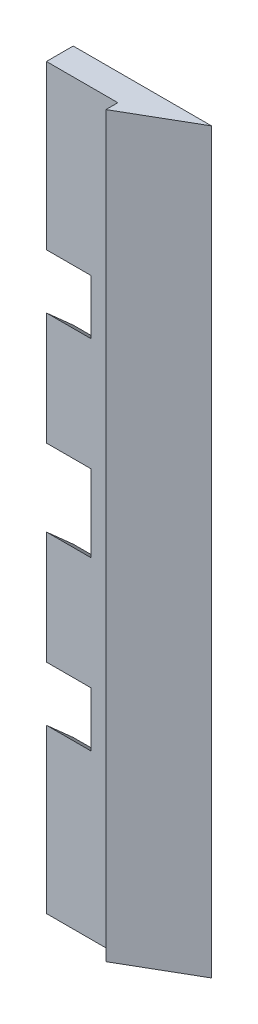
ISO-10303-21;
HEADER;
FILE_DESCRIPTION(('STEP AP214'),'2;1');
FILE_NAME('part.step','',(''),(''),'','','');
FILE_SCHEMA(('AUTOMOTIVE_DESIGN { 1 0 10303 214 1 1 1 1 }'));
ENDSEC;
DATA;
#1=APPLICATION_CONTEXT('core data for automotive mechanical design processes');
#2=APPLICATION_PROTOCOL_DEFINITION('international standard','automotive_design',2000,#1);
#3=PRODUCT_CONTEXT('',#1,'mechanical');
#4=PRODUCT('Part','Part','',(#3));
#5=PRODUCT_RELATED_PRODUCT_CATEGORY('part','',(#4));
#6=PRODUCT_DEFINITION_FORMATION('','',#4);
#7=PRODUCT_DEFINITION_CONTEXT('part definition',#1,'design');
#8=PRODUCT_DEFINITION('design','',#6,#7);
#9=PRODUCT_DEFINITION_SHAPE('','',#8);
#10=(LENGTH_UNIT() NAMED_UNIT(*) SI_UNIT(.MILLI.,.METRE.));
#11=(NAMED_UNIT(*) PLANE_ANGLE_UNIT() SI_UNIT($,.RADIAN.));
#12=(NAMED_UNIT(*) SI_UNIT($,.STERADIAN.) SOLID_ANGLE_UNIT());
#13=UNCERTAINTY_MEASURE_WITH_UNIT(LENGTH_MEASURE(1.E-05),#10,'distance_accuracy_value','');
#14=(GEOMETRIC_REPRESENTATION_CONTEXT(3) GLOBAL_UNCERTAINTY_ASSIGNED_CONTEXT((#13)) GLOBAL_UNIT_ASSIGNED_CONTEXT((#10,
#11,#12)) REPRESENTATION_CONTEXT('',''));
#15=CARTESIAN_POINT('',(0.,0.,0.));
#16=DIRECTION('',(0.,0.,1.));
#17=DIRECTION('',(1.,0.,0.));
#18=AXIS2_PLACEMENT_3D('',#15,#16,#17);
#19=CARTESIAN_POINT('',(0.,-99.2,4.));
#20=DIRECTION('',(-1.,0.,0.));
#21=DIRECTION('',(0.,0.,1.));
#22=AXIS2_PLACEMENT_3D('',#19,#20,#21);
#23=PLANE('',#22);
#24=DIRECTION('',(0.,-1.,0.));
#25=VECTOR('',#24,1.);
#26=CARTESIAN_POINT('',(0.,0.,3.6));
#27=LINE('',#26,#25);
#28=CARTESIAN_POINT('',(0.,0.,3.6));
#29=VERTEX_POINT('',#28);
#30=CARTESIAN_POINT('',(0.,-21.925,3.6));
#31=VERTEX_POINT('',#30);
#32=EDGE_CURVE('E199',#29,#31,#27,.T.);
#33=ORIENTED_EDGE('',*,*,#32,.F.);
#34=DIRECTION('',(0.,0.,1.));
#35=VECTOR('',#34,1.);
#36=CARTESIAN_POINT('',(0.,0.,4.));
#37=LINE('',#36,#35);
#38=CARTESIAN_POINT('',(0.,0.,0.));
#39=VERTEX_POINT('',#38);
#40=EDGE_CURVE('E179',#39,#29,#37,.T.);
#41=ORIENTED_EDGE('',*,*,#40,.F.);
#42=DIRECTION('',(0.,1.,0.));
#43=VECTOR('',#42,1.);
#44=CARTESIAN_POINT('',(0.,-99.2,0.));
#45=LINE('',#44,#43);
#46=CARTESIAN_POINT('',(0.,-18.7075,0.));
#47=VERTEX_POINT('',#46);
#48=EDGE_CURVE('E304',#47,#39,#45,.T.);
#49=ORIENTED_EDGE('',*,*,#48,.F.);
#50=DIRECTION('',(0.,0.666386109322577,-0.745606835605682));
#51=VECTOR('',#50,1.);
#52=CARTESIAN_POINT('',(0.,-18.35,-0.400000000000002));
#53=LINE('',#52,#51);
#54=EDGE_CURVE('E211',#31,#47,#53,.T.);
#55=ORIENTED_EDGE('',*,*,#54,.F.);
#56=EDGE_LOOP('',(#33,#41,#49,#55));
#57=FACE_BOUND('',#56,.T.);
#58=ADVANCED_FACE('F45',(#57),#23,.T.);
#59=CARTESIAN_POINT('',(0.,-29.275,3.6));
#60=VERTEX_POINT('',#59);
#61=CARTESIAN_POINT('',(0.,-44.425,3.6));
#62=VERTEX_POINT('',#61);
#63=EDGE_CURVE('E202',#60,#62,#27,.T.);
#64=ORIENTED_EDGE('',*,*,#63,.F.);
#65=DIRECTION('',(0.,0.666386109322577,0.745606835605682));
#66=VECTOR('',#65,1.);
#67=CARTESIAN_POINT('',(0.,-29.275,3.6));
#68=LINE('',#67,#66);
#69=CARTESIAN_POINT('',(0.,-32.4925,0.));
#70=VERTEX_POINT('',#69);
#71=EDGE_CURVE('E217',#70,#60,#68,.T.);
#72=ORIENTED_EDGE('',*,*,#71,.F.);
#73=CARTESIAN_POINT('',(0.,-41.2075,0.));
#74=VERTEX_POINT('',#73);
#75=EDGE_CURVE('E346',#74,#70,#45,.T.);
#76=ORIENTED_EDGE('',*,*,#75,.F.);
#77=DIRECTION('',(0.,0.666386109322578,-0.745606835605681));
#78=VECTOR('',#77,1.);
#79=CARTESIAN_POINT('',(0.,-40.85,-0.400000000000002));
#80=LINE('',#79,#78);
#81=EDGE_CURVE('E238',#62,#74,#80,.T.);
#82=ORIENTED_EDGE('',*,*,#81,.F.);
#83=EDGE_LOOP('',(#64,#72,#76,#82));
#84=FACE_BOUND('',#83,.T.);
#85=ADVANCED_FACE('F344',(#84),#23,.T.);
#86=CARTESIAN_POINT('',(0.,-54.775,3.6));
#87=VERTEX_POINT('',#86);
#88=CARTESIAN_POINT('',(0.,-69.925,3.6));
#89=VERTEX_POINT('',#88);
#90=EDGE_CURVE('E197',#87,#89,#27,.T.);
#91=ORIENTED_EDGE('',*,*,#90,.F.);
#92=DIRECTION('',(0.,0.666386109322578,0.745606835605681));
#93=VECTOR('',#92,1.);
#94=CARTESIAN_POINT('',(0.,-54.775,3.6));
#95=LINE('',#94,#93);
#96=CARTESIAN_POINT('',(0.,-57.9925,0.));
#97=VERTEX_POINT('',#96);
#98=EDGE_CURVE('E221',#97,#87,#95,.T.);
#99=ORIENTED_EDGE('',*,*,#98,.F.);
#100=CARTESIAN_POINT('',(0.,-66.7075,0.));
#101=VERTEX_POINT('',#100);
#102=EDGE_CURVE('E303',#101,#97,#45,.T.);
#103=ORIENTED_EDGE('',*,*,#102,.F.);
#104=DIRECTION('',(0.,0.666386109322578,-0.745606835605681));
#105=VECTOR('',#104,1.);
#106=CARTESIAN_POINT('',(0.,-69.925,3.6));
#107=LINE('',#106,#105);
#108=EDGE_CURVE('E237',#89,#101,#107,.T.);
#109=ORIENTED_EDGE('',*,*,#108,.F.);
#110=EDGE_LOOP('',(#91,#99,#103,#109));
#111=FACE_BOUND('',#110,.T.);
#112=ADVANCED_FACE('F384',(#111),#23,.T.);
#113=CARTESIAN_POINT('',(0.,-77.275,3.6));
#114=VERTEX_POINT('',#113);
#115=CARTESIAN_POINT('',(0.,-99.2,3.6));
#116=VERTEX_POINT('',#115);
#117=EDGE_CURVE('E194',#114,#116,#27,.T.);
#118=ORIENTED_EDGE('',*,*,#117,.F.);
#119=DIRECTION('',(0.,0.666386109322578,0.745606835605681));
#120=VECTOR('',#119,1.);
#121=CARTESIAN_POINT('',(0.,-80.85,-0.400000000000002));
#122=LINE('',#121,#120);
#123=CARTESIAN_POINT('',(0.,-80.4925,0.));
#124=VERTEX_POINT('',#123);
#125=EDGE_CURVE('E260',#124,#114,#122,.T.);
#126=ORIENTED_EDGE('',*,*,#125,.F.);
#127=CARTESIAN_POINT('',(0.,-99.2,0.));
#128=VERTEX_POINT('',#127);
#129=EDGE_CURVE('E298',#128,#124,#45,.T.);
#130=ORIENTED_EDGE('',*,*,#129,.F.);
#131=DIRECTION('',(0.,0.,1.));
#132=VECTOR('',#131,1.);
#133=CARTESIAN_POINT('',(0.,-99.2,4.));
#134=LINE('',#133,#132);
#135=EDGE_CURVE('E276',#128,#116,#134,.T.);
#136=ORIENTED_EDGE('',*,*,#135,.T.);
#137=EDGE_LOOP('',(#118,#126,#130,#136));
#138=FACE_BOUND('',#137,.T.);
#139=ADVANCED_FACE('F47',(#138),#23,.T.);
#140=CARTESIAN_POINT('',(0.,-99.2,0.));
#141=DIRECTION('',(0.,0.,-1.));
#142=DIRECTION('',(-1.,0.,0.));
#143=AXIS2_PLACEMENT_3D('',#140,#141,#142);
#144=PLANE('',#143);
#145=DIRECTION('',(1.,0.,0.));
#146=VECTOR('',#145,1.);
#147=CARTESIAN_POINT('',(0.,-18.7075,0.));
#148=LINE('',#147,#146);
#149=CARTESIAN_POINT('',(6.,-18.7075,0.));
#150=VERTEX_POINT('',#149);
#151=EDGE_CURVE('E11',#47,#150,#148,.T.);
#152=ORIENTED_EDGE('',*,*,#151,.F.);
#153=ORIENTED_EDGE('',*,*,#48,.T.);
#154=DIRECTION('',(-1.,0.,0.));
#155=VECTOR('',#154,1.);
#156=CARTESIAN_POINT('',(0.,0.,0.));
#157=LINE('',#156,#155);
#158=CARTESIAN_POINT('',(18.6,0.,0.));
#159=VERTEX_POINT('',#158);
#160=EDGE_CURVE('E281',#159,#39,#157,.T.);
#161=ORIENTED_EDGE('',*,*,#160,.F.);
#162=DIRECTION('',(0.,1.,0.));
#163=VECTOR('',#162,1.);
#164=CARTESIAN_POINT('',(18.6,-99.2,0.));
#165=LINE('',#164,#163);
#166=CARTESIAN_POINT('',(18.6,-99.2,0.));
#167=VERTEX_POINT('',#166);
#168=EDGE_CURVE('E305',#167,#159,#165,.T.);
#169=ORIENTED_EDGE('',*,*,#168,.F.);
#170=DIRECTION('',(-1.,0.,0.));
#171=VECTOR('',#170,1.);
#172=CARTESIAN_POINT('',(0.,-99.2,0.));
#173=LINE('',#172,#171);
#174=EDGE_CURVE('E288',#167,#128,#173,.T.);
#175=ORIENTED_EDGE('',*,*,#174,.T.);
#176=ORIENTED_EDGE('',*,*,#129,.T.);
#177=DIRECTION('',(-1.,0.,0.));
#178=VECTOR('',#177,1.);
#179=CARTESIAN_POINT('',(0.,-80.4925,0.));
#180=LINE('',#179,#178);
#181=CARTESIAN_POINT('',(6.,-80.4925,0.));
#182=VERTEX_POINT('',#181);
#183=EDGE_CURVE('E317',#182,#124,#180,.T.);
#184=ORIENTED_EDGE('',*,*,#183,.F.);
#185=DIRECTION('',(0.,1.,0.));
#186=VECTOR('',#185,1.);
#187=CARTESIAN_POINT('',(6.,-99.2,0.));
#188=LINE('',#187,#186);
#189=CARTESIAN_POINT('',(6.,-66.7075,0.));
#190=VERTEX_POINT('',#189);
#191=EDGE_CURVE('E302',#182,#190,#188,.T.);
#192=ORIENTED_EDGE('',*,*,#191,.T.);
#193=DIRECTION('',(1.,0.,0.));
#194=VECTOR('',#193,1.);
#195=CARTESIAN_POINT('',(0.,-66.7075,0.));
#196=LINE('',#195,#194);
#197=EDGE_CURVE('E313',#101,#190,#196,.T.);
#198=ORIENTED_EDGE('',*,*,#197,.F.);
#199=ORIENTED_EDGE('',*,*,#102,.T.);
#200=DIRECTION('',(-1.,0.,0.));
#201=VECTOR('',#200,1.);
#202=CARTESIAN_POINT('',(0.,-57.9925,0.));
#203=LINE('',#202,#201);
#204=CARTESIAN_POINT('',(6.,-57.9925,0.));
#205=VERTEX_POINT('',#204);
#206=EDGE_CURVE('E323',#205,#97,#203,.T.);
#207=ORIENTED_EDGE('',*,*,#206,.F.);
#208=DIRECTION('',(0.,-1.,0.));
#209=VECTOR('',#208,1.);
#210=CARTESIAN_POINT('',(6.,-99.2,0.));
#211=LINE('',#210,#209);
#212=CARTESIAN_POINT('',(6.,-41.2075,0.));
#213=VERTEX_POINT('',#212);
#214=EDGE_CURVE('E320',#213,#205,#211,.T.);
#215=ORIENTED_EDGE('',*,*,#214,.F.);
#216=DIRECTION('',(1.,0.,0.));
#217=VECTOR('',#216,1.);
#218=CARTESIAN_POINT('',(0.,-41.2075,0.));
#219=LINE('',#218,#217);
#220=EDGE_CURVE('E326',#74,#213,#219,.T.);
#221=ORIENTED_EDGE('',*,*,#220,.F.);
#222=ORIENTED_EDGE('',*,*,#75,.T.);
#223=DIRECTION('',(-1.,0.,0.));
#224=VECTOR('',#223,1.);
#225=CARTESIAN_POINT('',(0.,-32.4925,0.));
#226=LINE('',#225,#224);
#227=CARTESIAN_POINT('',(6.,-32.4925,0.));
#228=VERTEX_POINT('',#227);
#229=EDGE_CURVE('E54',#228,#70,#226,.T.);
#230=ORIENTED_EDGE('',*,*,#229,.F.);
#231=DIRECTION('',(0.,-1.,0.));
#232=VECTOR('',#231,1.);
#233=CARTESIAN_POINT('',(6.,-99.2,0.));
#234=LINE('',#233,#232);
#235=EDGE_CURVE('E329',#150,#228,#234,.T.);
#236=ORIENTED_EDGE('',*,*,#235,.F.);
#237=EDGE_LOOP('',(#152,#153,#161,#169,#175,#176,#184,#192,#198,#199,#207,#215,#221,#222,#230,#236));
#238=FACE_BOUND('',#237,.T.);
#239=ADVANCED_FACE('F349',(#238),#144,.T.);
#240=CARTESIAN_POINT('',(18.6,-99.2,0.));
#241=DIRECTION('',(0.500277597874629,0.,0.865865073244551));
#242=DIRECTION('',(0.865865073244551,0.,-0.500277597874629));
#243=AXIS2_PLACEMENT_3D('',#240,#241,#242);
#244=PLANE('',#243);
#245=DIRECTION('',(0.865865073244551,0.,-0.500277597874629));
#246=VECTOR('',#245,1.);
#247=CARTESIAN_POINT('',(18.6,0.,0.));
#248=LINE('',#247,#246);
#249=CARTESIAN_POINT('',(9.6,0.,5.2));
#250=VERTEX_POINT('',#249);
#251=EDGE_CURVE('E178',#250,#159,#248,.T.);
#252=ORIENTED_EDGE('',*,*,#251,.F.);
#253=DIRECTION('',(0.,1.,0.));
#254=VECTOR('',#253,1.);
#255=CARTESIAN_POINT('',(9.6,-99.2,5.2));
#256=LINE('',#255,#254);
#257=CARTESIAN_POINT('',(9.6,-99.2,5.2));
#258=VERTEX_POINT('',#257);
#259=EDGE_CURVE('E172',#258,#250,#256,.T.);
#260=ORIENTED_EDGE('',*,*,#259,.F.);
#261=DIRECTION('',(0.865865073244551,0.,-0.500277597874629));
#262=VECTOR('',#261,1.);
#263=CARTESIAN_POINT('',(18.6,-99.2,0.));
#264=LINE('',#263,#262);
#265=EDGE_CURVE('E284',#258,#167,#264,.T.);
#266=ORIENTED_EDGE('',*,*,#265,.T.);
#267=ORIENTED_EDGE('',*,*,#168,.T.);
#268=EDGE_LOOP('',(#252,#260,#266,#267));
#269=FACE_BOUND('',#268,.T.);
#270=ADVANCED_FACE('F360',(#269),#244,.T.);
#271=CARTESIAN_POINT('',(9.6,-99.2,4.));
#272=DIRECTION('',(-1.,0.,0.));
#273=DIRECTION('',(0.,0.,1.));
#274=AXIS2_PLACEMENT_3D('',#271,#272,#273);
#275=PLANE('',#274);
#276=DIRECTION('',(0.,0.,1.));
#277=VECTOR('',#276,1.);
#278=CARTESIAN_POINT('',(9.6,0.,4.));
#279=LINE('',#278,#277);
#280=CARTESIAN_POINT('',(9.6,0.,3.6));
#281=VERTEX_POINT('',#280);
#282=EDGE_CURVE('E166',#281,#250,#279,.T.);
#283=ORIENTED_EDGE('',*,*,#282,.F.);
#284=DIRECTION('',(0.,1.,0.));
#285=VECTOR('',#284,1.);
#286=CARTESIAN_POINT('',(9.6,0.,3.6));
#287=LINE('',#286,#285);
#288=CARTESIAN_POINT('',(9.6,-99.2,3.6));
#289=VERTEX_POINT('',#288);
#290=EDGE_CURVE('E170',#289,#281,#287,.T.);
#291=ORIENTED_EDGE('',*,*,#290,.F.);
#292=DIRECTION('',(0.,0.,1.));
#293=VECTOR('',#292,1.);
#294=CARTESIAN_POINT('',(9.6,-99.2,4.));
#295=LINE('',#294,#293);
#296=EDGE_CURVE('E280',#289,#258,#295,.T.);
#297=ORIENTED_EDGE('',*,*,#296,.T.);
#298=ORIENTED_EDGE('',*,*,#259,.T.);
#299=EDGE_LOOP('',(#283,#291,#297,#298));
#300=FACE_BOUND('',#299,.T.);
#301=ADVANCED_FACE('F168',(#300),#275,.T.);
#302=CARTESIAN_POINT('',(0.,-99.2,0.));
#303=DIRECTION('',(0.,-1.,0.));
#304=DIRECTION('',(0.,0.,-1.));
#305=AXIS2_PLACEMENT_3D('',#302,#303,#304);
#306=PLANE('',#305);
#307=ORIENTED_EDGE('',*,*,#296,.F.);
#308=DIRECTION('',(1.,0.,0.));
#309=VECTOR('',#308,1.);
#310=CARTESIAN_POINT('',(9.6,-99.2,3.6));
#311=LINE('',#310,#309);
#312=EDGE_CURVE('E186',#116,#289,#311,.T.);
#313=ORIENTED_EDGE('',*,*,#312,.F.);
#314=ORIENTED_EDGE('',*,*,#135,.F.);
#315=ORIENTED_EDGE('',*,*,#174,.F.);
#316=ORIENTED_EDGE('',*,*,#265,.F.);
#317=EDGE_LOOP('',(#307,#313,#314,#315,#316));
#318=FACE_BOUND('',#317,.T.);
#319=ADVANCED_FACE('F366',(#318),#306,.T.);
#320=CARTESIAN_POINT('',(0.,0.,0.));
#321=DIRECTION('',(0.,-1.,0.));
#322=DIRECTION('',(0.,0.,-1.));
#323=AXIS2_PLACEMENT_3D('',#320,#321,#322);
#324=PLANE('',#323);
#325=DIRECTION('',(-1.,0.,0.));
#326=VECTOR('',#325,1.);
#327=CARTESIAN_POINT('',(9.6,0.,3.6));
#328=LINE('',#327,#326);
#329=EDGE_CURVE('E183',#281,#29,#328,.T.);
#330=ORIENTED_EDGE('',*,*,#329,.F.);
#331=ORIENTED_EDGE('',*,*,#282,.T.);
#332=ORIENTED_EDGE('',*,*,#251,.T.);
#333=ORIENTED_EDGE('',*,*,#160,.T.);
#334=ORIENTED_EDGE('',*,*,#40,.T.);
#335=EDGE_LOOP('',(#330,#331,#332,#333,#334));
#336=FACE_BOUND('',#335,.T.);
#337=ADVANCED_FACE('F190',(#336),#324,.F.);
#338=CARTESIAN_POINT('',(6.,-80.85,-0.400000000000001));
#339=DIRECTION('',(0.,-0.745606835605681,0.666386109322578));
#340=DIRECTION('',(0.,-0.666386109322578,-0.745606835605681));
#341=AXIS2_PLACEMENT_3D('',#338,#339,#340);
#342=PLANE('',#341);
#343=ORIENTED_EDGE('',*,*,#183,.T.);
#344=ORIENTED_EDGE('',*,*,#125,.T.);
#345=DIRECTION('',(-1.,0.,0.));
#346=VECTOR('',#345,1.);
#347=CARTESIAN_POINT('',(6.,-77.275,3.6));
#348=LINE('',#347,#346);
#349=CARTESIAN_POINT('',(6.,-77.275,3.6));
#350=VERTEX_POINT('',#349);
#351=EDGE_CURVE('E205',#350,#114,#348,.T.);
#352=ORIENTED_EDGE('',*,*,#351,.F.);
#353=DIRECTION('',(0.,0.666386109322578,0.745606835605681));
#354=VECTOR('',#353,1.);
#355=CARTESIAN_POINT('',(6.,-80.85,-0.400000000000001));
#356=LINE('',#355,#354);
#357=EDGE_CURVE('E257',#182,#350,#356,.T.);
#358=ORIENTED_EDGE('',*,*,#357,.F.);
#359=EDGE_LOOP('',(#343,#344,#352,#358));
#360=FACE_BOUND('',#359,.T.);
#361=ADVANCED_FACE('F372',(#360),#342,.F.);
#362=CARTESIAN_POINT('',(6.,-69.925,3.6));
#363=DIRECTION('',(0.,0.745606835605681,0.666386109322578));
#364=DIRECTION('',(0.,-0.666386109322578,0.745606835605681));
#365=AXIS2_PLACEMENT_3D('',#362,#363,#364);
#366=PLANE('',#365);
#367=ORIENTED_EDGE('',*,*,#197,.T.);
#368=DIRECTION('',(0.,0.666386109322578,-0.745606835605681));
#369=VECTOR('',#368,1.);
#370=CARTESIAN_POINT('',(6.,-69.925,3.6));
#371=LINE('',#370,#369);
#372=CARTESIAN_POINT('',(6.,-69.925,3.6));
#373=VERTEX_POINT('',#372);
#374=EDGE_CURVE('E270',#373,#190,#371,.T.);
#375=ORIENTED_EDGE('',*,*,#374,.F.);
#376=DIRECTION('',(-1.,0.,0.));
#377=VECTOR('',#376,1.);
#378=CARTESIAN_POINT('',(6.,-69.925,3.6));
#379=LINE('',#378,#377);
#380=EDGE_CURVE('E253',#373,#89,#379,.T.);
#381=ORIENTED_EDGE('',*,*,#380,.T.);
#382=ORIENTED_EDGE('',*,*,#108,.T.);
#383=EDGE_LOOP('',(#367,#375,#381,#382));
#384=FACE_BOUND('',#383,.T.);
#385=ADVANCED_FACE('F380',(#384),#366,.F.);
#386=CARTESIAN_POINT('',(6.,0.,0.));
#387=DIRECTION('',(-1.,0.,0.));
#388=DIRECTION('',(0.,0.,1.));
#389=AXIS2_PLACEMENT_3D('',#386,#387,#388);
#390=PLANE('',#389);
#391=ORIENTED_EDGE('',*,*,#357,.T.);
#392=DIRECTION('',(0.,1.,0.));
#393=VECTOR('',#392,1.);
#394=CARTESIAN_POINT('',(6.,-77.275,3.6));
#395=LINE('',#394,#393);
#396=EDGE_CURVE('E264',#350,#373,#395,.T.);
#397=ORIENTED_EDGE('',*,*,#396,.T.);
#398=ORIENTED_EDGE('',*,*,#374,.T.);
#399=ORIENTED_EDGE('',*,*,#191,.F.);
#400=EDGE_LOOP('',(#391,#397,#398,#399));
#401=FACE_BOUND('',#400,.T.);
#402=ADVANCED_FACE('F377',(#401),#390,.T.);
#403=CARTESIAN_POINT('',(6.,-40.85,-0.400000000000002));
#404=DIRECTION('',(0.,0.745606835605681,0.666386109322578));
#405=DIRECTION('',(0.,-0.666386109322578,0.745606835605681));
#406=AXIS2_PLACEMENT_3D('',#403,#404,#405);
#407=PLANE('',#406);
#408=ORIENTED_EDGE('',*,*,#220,.T.);
#409=DIRECTION('',(0.,0.666386109322578,-0.745606835605681));
#410=VECTOR('',#409,1.);
#411=CARTESIAN_POINT('',(6.,-40.85,-0.400000000000002));
#412=LINE('',#411,#410);
#413=CARTESIAN_POINT('',(6.,-44.425,3.6));
#414=VERTEX_POINT('',#413);
#415=EDGE_CURVE('E68',#414,#213,#412,.T.);
#416=ORIENTED_EDGE('',*,*,#415,.F.);
#417=DIRECTION('',(-1.,0.,0.));
#418=VECTOR('',#417,1.);
#419=CARTESIAN_POINT('',(6.,-44.425,3.6));
#420=LINE('',#419,#418);
#421=EDGE_CURVE('E233',#414,#62,#420,.T.);
#422=ORIENTED_EDGE('',*,*,#421,.T.);
#423=ORIENTED_EDGE('',*,*,#81,.T.);
#424=EDGE_LOOP('',(#408,#416,#422,#423));
#425=FACE_BOUND('',#424,.T.);
#426=ADVANCED_FACE('F393',(#425),#407,.F.);
#427=CARTESIAN_POINT('',(6.,-54.775,3.6));
#428=DIRECTION('',(0.,-0.745606835605681,0.666386109322578));
#429=DIRECTION('',(0.,-0.666386109322578,-0.745606835605681));
#430=AXIS2_PLACEMENT_3D('',#427,#428,#429);
#431=PLANE('',#430);
#432=ORIENTED_EDGE('',*,*,#206,.T.);
#433=ORIENTED_EDGE('',*,*,#98,.T.);
#434=DIRECTION('',(-1.,0.,0.));
#435=VECTOR('',#434,1.);
#436=CARTESIAN_POINT('',(6.,-54.775,3.6));
#437=LINE('',#436,#435);
#438=CARTESIAN_POINT('',(6.,-54.775,3.6));
#439=VERTEX_POINT('',#438);
#440=EDGE_CURVE('E230',#439,#87,#437,.T.);
#441=ORIENTED_EDGE('',*,*,#440,.F.);
#442=DIRECTION('',(0.,0.666386109322578,0.745606835605681));
#443=VECTOR('',#442,1.);
#444=CARTESIAN_POINT('',(6.,-54.775,3.6));
#445=LINE('',#444,#443);
#446=EDGE_CURVE('E241',#205,#439,#445,.T.);
#447=ORIENTED_EDGE('',*,*,#446,.F.);
#448=EDGE_LOOP('',(#432,#433,#441,#447));
#449=FACE_BOUND('',#448,.T.);
#450=ADVANCED_FACE('F389',(#449),#431,.F.);
#451=CARTESIAN_POINT('',(6.,0.,0.));
#452=DIRECTION('',(1.,0.,0.));
#453=DIRECTION('',(0.,0.,-1.));
#454=AXIS2_PLACEMENT_3D('',#451,#452,#453);
#455=PLANE('',#454);
#456=ORIENTED_EDGE('',*,*,#214,.T.);
#457=ORIENTED_EDGE('',*,*,#446,.T.);
#458=DIRECTION('',(0.,1.,0.));
#459=VECTOR('',#458,1.);
#460=CARTESIAN_POINT('',(6.,-44.425,3.6));
#461=LINE('',#460,#459);
#462=EDGE_CURVE('E247',#439,#414,#461,.T.);
#463=ORIENTED_EDGE('',*,*,#462,.T.);
#464=ORIENTED_EDGE('',*,*,#415,.T.);
#465=EDGE_LOOP('',(#456,#457,#463,#464));
#466=FACE_BOUND('',#465,.T.);
#467=ADVANCED_FACE('F391',(#466),#455,.F.);
#468=CARTESIAN_POINT('',(6.,-18.35,-0.400000000000001));
#469=DIRECTION('',(0.,0.745606835605682,0.666386109322577));
#470=DIRECTION('',(0.,-0.666386109322577,0.745606835605682));
#471=AXIS2_PLACEMENT_3D('',#468,#469,#470);
#472=PLANE('',#471);
#473=ORIENTED_EDGE('',*,*,#151,.T.);
#474=DIRECTION('',(0.,0.666386109322577,-0.745606835605682));
#475=VECTOR('',#474,1.);
#476=CARTESIAN_POINT('',(6.,-18.35,-0.400000000000001));
#477=LINE('',#476,#475);
#478=CARTESIAN_POINT('',(6.,-21.925,3.6));
#479=VERTEX_POINT('',#478);
#480=EDGE_CURVE('E61',#479,#150,#477,.T.);
#481=ORIENTED_EDGE('',*,*,#480,.F.);
#482=DIRECTION('',(-1.,0.,0.));
#483=VECTOR('',#482,1.);
#484=CARTESIAN_POINT('',(6.,-21.925,3.6));
#485=LINE('',#484,#483);
#486=EDGE_CURVE('E224',#479,#31,#485,.T.);
#487=ORIENTED_EDGE('',*,*,#486,.T.);
#488=ORIENTED_EDGE('',*,*,#54,.T.);
#489=EDGE_LOOP('',(#473,#481,#487,#488));
#490=FACE_BOUND('',#489,.T.);
#491=ADVANCED_FACE('F404',(#490),#472,.F.);
#492=CARTESIAN_POINT('',(6.,-29.275,3.6));
#493=DIRECTION('',(0.,-0.745606835605682,0.666386109322577));
#494=DIRECTION('',(0.,-0.666386109322577,-0.745606835605682));
#495=AXIS2_PLACEMENT_3D('',#492,#493,#494);
#496=PLANE('',#495);
#497=ORIENTED_EDGE('',*,*,#229,.T.);
#498=ORIENTED_EDGE('',*,*,#71,.T.);
#499=DIRECTION('',(-1.,0.,0.));
#500=VECTOR('',#499,1.);
#501=CARTESIAN_POINT('',(6.,-29.275,3.6));
#502=LINE('',#501,#500);
#503=CARTESIAN_POINT('',(6.,-29.275,3.6));
#504=VERTEX_POINT('',#503);
#505=EDGE_CURVE('E216',#504,#60,#502,.T.);
#506=ORIENTED_EDGE('',*,*,#505,.F.);
#507=DIRECTION('',(0.,0.666386109322577,0.745606835605682));
#508=VECTOR('',#507,1.);
#509=CARTESIAN_POINT('',(6.,-29.275,3.6));
#510=LINE('',#509,#508);
#511=EDGE_CURVE('E206',#228,#504,#510,.T.);
#512=ORIENTED_EDGE('',*,*,#511,.F.);
#513=EDGE_LOOP('',(#497,#498,#506,#512));
#514=FACE_BOUND('',#513,.T.);
#515=ADVANCED_FACE('F336',(#514),#496,.F.);
#516=CARTESIAN_POINT('',(6.,0.,0.));
#517=DIRECTION('',(1.,0.,0.));
#518=DIRECTION('',(0.,0.,-1.));
#519=AXIS2_PLACEMENT_3D('',#516,#517,#518);
#520=PLANE('',#519);
#521=ORIENTED_EDGE('',*,*,#235,.T.);
#522=ORIENTED_EDGE('',*,*,#511,.T.);
#523=DIRECTION('',(0.,1.,0.));
#524=VECTOR('',#523,1.);
#525=CARTESIAN_POINT('',(6.,-21.925,3.6));
#526=LINE('',#525,#524);
#527=EDGE_CURVE('E210',#504,#479,#526,.T.);
#528=ORIENTED_EDGE('',*,*,#527,.T.);
#529=ORIENTED_EDGE('',*,*,#480,.T.);
#530=EDGE_LOOP('',(#521,#522,#528,#529));
#531=FACE_BOUND('',#530,.T.);
#532=ADVANCED_FACE('F396',(#531),#520,.F.);
#533=CARTESIAN_POINT('',(0.,0.,3.6));
#534=DIRECTION('',(0.,0.,-1.));
#535=DIRECTION('',(-1.,0.,0.));
#536=AXIS2_PLACEMENT_3D('',#533,#534,#535);
#537=PLANE('',#536);
#538=ORIENTED_EDGE('',*,*,#117,.T.);
#539=ORIENTED_EDGE('',*,*,#312,.T.);
#540=ORIENTED_EDGE('',*,*,#290,.T.);
#541=ORIENTED_EDGE('',*,*,#329,.T.);
#542=ORIENTED_EDGE('',*,*,#32,.T.);
#543=ORIENTED_EDGE('',*,*,#486,.F.);
#544=ORIENTED_EDGE('',*,*,#527,.F.);
#545=ORIENTED_EDGE('',*,*,#505,.T.);
#546=ORIENTED_EDGE('',*,*,#63,.T.);
#547=ORIENTED_EDGE('',*,*,#421,.F.);
#548=ORIENTED_EDGE('',*,*,#462,.F.);
#549=ORIENTED_EDGE('',*,*,#440,.T.);
#550=ORIENTED_EDGE('',*,*,#90,.T.);
#551=ORIENTED_EDGE('',*,*,#380,.F.);
#552=ORIENTED_EDGE('',*,*,#396,.F.);
#553=ORIENTED_EDGE('',*,*,#351,.T.);
#554=EDGE_LOOP('',(#538,#539,#540,#541,#542,#543,#544,#545,#546,#547,#548,#549,#550,#551,#552,#553));
#555=FACE_BOUND('',#554,.T.);
#556=ADVANCED_FACE('F182',(#555),#537,.F.);
#557=CLOSED_SHELL('',(#58,#85,#112,#139,#239,#270,#301,#319,#337,#361,#385,#402,#426,#450,#467,
#491,#515,#532,#556));
#558=MANIFOLD_SOLID_BREP('B2',#557);
#559=ADVANCED_BREP_SHAPE_REPRESENTATION('',(#18,#558),#14);
#560=SHAPE_DEFINITION_REPRESENTATION(#9,#559);
ENDSEC;
END-ISO-10303-21;
